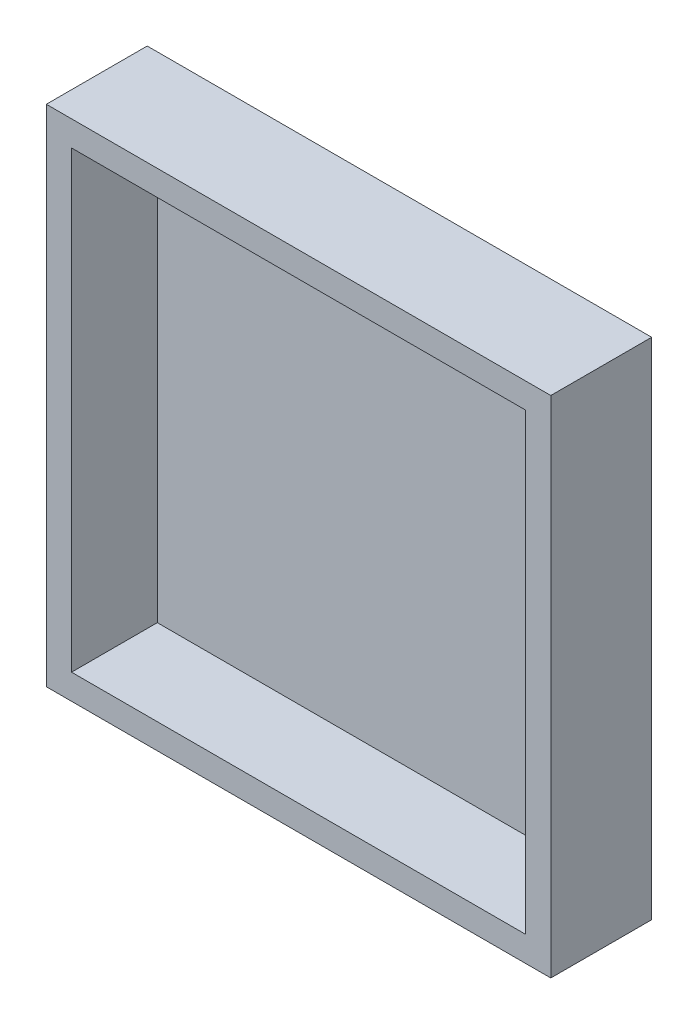
ISO-10303-21;
HEADER;
FILE_DESCRIPTION(('STEP AP214'),'2;1');
FILE_NAME('part.step','',(''),(''),'','','');
FILE_SCHEMA(('AUTOMOTIVE_DESIGN { 1 0 10303 214 1 1 1 1 }'));
ENDSEC;
DATA;
#1=APPLICATION_CONTEXT('core data for automotive mechanical design processes');
#2=APPLICATION_PROTOCOL_DEFINITION('international standard','automotive_design',2000,#1);
#3=PRODUCT_CONTEXT('',#1,'mechanical');
#4=PRODUCT('Part','Part','',(#3));
#5=PRODUCT_RELATED_PRODUCT_CATEGORY('part','',(#4));
#6=PRODUCT_DEFINITION_FORMATION('','',#4);
#7=PRODUCT_DEFINITION_CONTEXT('part definition',#1,'design');
#8=PRODUCT_DEFINITION('design','',#6,#7);
#9=PRODUCT_DEFINITION_SHAPE('','',#8);
#10=(LENGTH_UNIT() NAMED_UNIT(*) SI_UNIT(.MILLI.,.METRE.));
#11=(NAMED_UNIT(*) PLANE_ANGLE_UNIT() SI_UNIT($,.RADIAN.));
#12=(NAMED_UNIT(*) SI_UNIT($,.STERADIAN.) SOLID_ANGLE_UNIT());
#13=UNCERTAINTY_MEASURE_WITH_UNIT(LENGTH_MEASURE(1.E-05),#10,'distance_accuracy_value','');
#14=(GEOMETRIC_REPRESENTATION_CONTEXT(3) GLOBAL_UNCERTAINTY_ASSIGNED_CONTEXT((#13)) GLOBAL_UNIT_ASSIGNED_CONTEXT((#10,
#11,#12)) REPRESENTATION_CONTEXT('',''));
#15=CARTESIAN_POINT('',(0.,0.,0.));
#16=DIRECTION('',(0.,0.,1.));
#17=DIRECTION('',(1.,0.,0.));
#18=AXIS2_PLACEMENT_3D('',#15,#16,#17);
#19=CARTESIAN_POINT('',(-63.5,63.5,25.4));
#20=DIRECTION('',(0.,1.,0.));
#21=DIRECTION('',(0.,0.,1.));
#22=AXIS2_PLACEMENT_3D('',#19,#20,#21);
#23=PLANE('',#22);
#24=DIRECTION('',(1.,0.,0.));
#25=VECTOR('',#24,1.);
#26=CARTESIAN_POINT('',(-63.5,63.5,0.));
#27=LINE('',#26,#25);
#28=CARTESIAN_POINT('',(-63.5,63.5,0.));
#29=VERTEX_POINT('',#28);
#30=CARTESIAN_POINT('',(63.5,63.5,0.));
#31=VERTEX_POINT('',#30);
#32=EDGE_CURVE('E157',#29,#31,#27,.T.);
#33=ORIENTED_EDGE('',*,*,#32,.F.);
#34=DIRECTION('',(0.,0.,-1.));
#35=VECTOR('',#34,1.);
#36=CARTESIAN_POINT('',(-63.5,63.5,25.4));
#37=LINE('',#36,#35);
#38=CARTESIAN_POINT('',(-63.5,63.5,25.4));
#39=VERTEX_POINT('',#38);
#40=EDGE_CURVE('E11',#39,#29,#37,.T.);
#41=ORIENTED_EDGE('',*,*,#40,.F.);
#42=DIRECTION('',(1.,0.,0.));
#43=VECTOR('',#42,1.);
#44=CARTESIAN_POINT('',(-63.5,63.5,25.4));
#45=LINE('',#44,#43);
#46=CARTESIAN_POINT('',(63.5,63.5,25.4));
#47=VERTEX_POINT('',#46);
#48=EDGE_CURVE('E163',#39,#47,#45,.T.);
#49=ORIENTED_EDGE('',*,*,#48,.T.);
#50=DIRECTION('',(0.,0.,-1.));
#51=VECTOR('',#50,1.);
#52=CARTESIAN_POINT('',(63.5,63.5,25.4));
#53=LINE('',#52,#51);
#54=EDGE_CURVE('E42',#47,#31,#53,.T.);
#55=ORIENTED_EDGE('',*,*,#54,.T.);
#56=EDGE_LOOP('',(#33,#41,#49,#55));
#57=FACE_BOUND('',#56,.T.);
#58=ADVANCED_FACE('F39',(#57),#23,.T.);
#59=CARTESIAN_POINT('',(-63.5,-63.5,25.4));
#60=DIRECTION('',(-1.,0.,0.));
#61=DIRECTION('',(0.,0.,1.));
#62=AXIS2_PLACEMENT_3D('',#59,#60,#61);
#63=PLANE('',#62);
#64=DIRECTION('',(0.,1.,0.));
#65=VECTOR('',#64,1.);
#66=CARTESIAN_POINT('',(-63.5,-63.5,0.));
#67=LINE('',#66,#65);
#68=CARTESIAN_POINT('',(-63.5,-63.5,0.));
#69=VERTEX_POINT('',#68);
#70=EDGE_CURVE('E166',#69,#29,#67,.T.);
#71=ORIENTED_EDGE('',*,*,#70,.F.);
#72=DIRECTION('',(0.,0.,-1.));
#73=VECTOR('',#72,1.);
#74=CARTESIAN_POINT('',(-63.5,-63.5,25.4));
#75=LINE('',#74,#73);
#76=CARTESIAN_POINT('',(-63.5,-63.5,25.4));
#77=VERTEX_POINT('',#76);
#78=EDGE_CURVE('E48',#77,#69,#75,.T.);
#79=ORIENTED_EDGE('',*,*,#78,.F.);
#80=DIRECTION('',(0.,1.,0.));
#81=VECTOR('',#80,1.);
#82=CARTESIAN_POINT('',(-63.5,-63.5,25.4));
#83=LINE('',#82,#81);
#84=EDGE_CURVE('E172',#77,#39,#83,.T.);
#85=ORIENTED_EDGE('',*,*,#84,.T.);
#86=ORIENTED_EDGE('',*,*,#40,.T.);
#87=EDGE_LOOP('',(#71,#79,#85,#86));
#88=FACE_BOUND('',#87,.T.);
#89=ADVANCED_FACE('F200',(#88),#63,.T.);
#90=CARTESIAN_POINT('',(-63.5,-63.5,25.4));
#91=DIRECTION('',(0.,1.,0.));
#92=DIRECTION('',(0.,0.,1.));
#93=AXIS2_PLACEMENT_3D('',#90,#91,#92);
#94=PLANE('',#93);
#95=DIRECTION('',(1.,0.,0.));
#96=VECTOR('',#95,1.);
#97=CARTESIAN_POINT('',(-63.5,-63.5,0.));
#98=LINE('',#97,#96);
#99=CARTESIAN_POINT('',(63.5,-63.5,0.));
#100=VERTEX_POINT('',#99);
#101=EDGE_CURVE('E182',#69,#100,#98,.T.);
#102=ORIENTED_EDGE('',*,*,#101,.T.);
#103=DIRECTION('',(0.,0.,-1.));
#104=VECTOR('',#103,1.);
#105=CARTESIAN_POINT('',(63.5,-63.5,25.4));
#106=LINE('',#105,#104);
#107=CARTESIAN_POINT('',(63.5,-63.5,25.4));
#108=VERTEX_POINT('',#107);
#109=EDGE_CURVE('E189',#108,#100,#106,.T.);
#110=ORIENTED_EDGE('',*,*,#109,.F.);
#111=DIRECTION('',(1.,0.,0.));
#112=VECTOR('',#111,1.);
#113=CARTESIAN_POINT('',(-63.5,-63.5,25.4));
#114=LINE('',#113,#112);
#115=EDGE_CURVE('E169',#77,#108,#114,.T.);
#116=ORIENTED_EDGE('',*,*,#115,.F.);
#117=ORIENTED_EDGE('',*,*,#78,.T.);
#118=EDGE_LOOP('',(#102,#110,#116,#117));
#119=FACE_BOUND('',#118,.T.);
#120=ADVANCED_FACE('F204',(#119),#94,.F.);
#121=CARTESIAN_POINT('',(63.5,-63.5,25.4));
#122=DIRECTION('',(-1.,0.,0.));
#123=DIRECTION('',(0.,0.,1.));
#124=AXIS2_PLACEMENT_3D('',#121,#122,#123);
#125=PLANE('',#124);
#126=DIRECTION('',(0.,1.,0.));
#127=VECTOR('',#126,1.);
#128=CARTESIAN_POINT('',(63.5,-63.5,0.));
#129=LINE('',#128,#127);
#130=EDGE_CURVE('E178',#100,#31,#129,.T.);
#131=ORIENTED_EDGE('',*,*,#130,.T.);
#132=ORIENTED_EDGE('',*,*,#54,.F.);
#133=DIRECTION('',(0.,1.,0.));
#134=VECTOR('',#133,1.);
#135=CARTESIAN_POINT('',(63.5,-63.5,25.4));
#136=LINE('',#135,#134);
#137=EDGE_CURVE('E89',#108,#47,#136,.T.);
#138=ORIENTED_EDGE('',*,*,#137,.F.);
#139=ORIENTED_EDGE('',*,*,#109,.T.);
#140=EDGE_LOOP('',(#131,#132,#138,#139));
#141=FACE_BOUND('',#140,.T.);
#142=ADVANCED_FACE('F196',(#141),#125,.F.);
#143=CARTESIAN_POINT('',(0.,0.,25.4));
#144=DIRECTION('',(0.,0.,1.));
#145=DIRECTION('',(1.,0.,0.));
#146=AXIS2_PLACEMENT_3D('',#143,#144,#145);
#147=PLANE('',#146);
#148=DIRECTION('',(0.,1.,0.));
#149=VECTOR('',#148,1.);
#150=CARTESIAN_POINT('',(57.15,-57.15,25.4));
#151=LINE('',#150,#149);
#152=CARTESIAN_POINT('',(57.15,-57.15,25.4));
#153=VERTEX_POINT('',#152);
#154=CARTESIAN_POINT('',(57.15,57.15,25.4));
#155=VERTEX_POINT('',#154);
#156=EDGE_CURVE('E56',#153,#155,#151,.T.);
#157=ORIENTED_EDGE('',*,*,#156,.F.);
#158=DIRECTION('',(1.,0.,0.));
#159=VECTOR('',#158,1.);
#160=CARTESIAN_POINT('',(-57.15,-57.15,25.4));
#161=LINE('',#160,#159);
#162=CARTESIAN_POINT('',(-57.15,-57.15,25.4));
#163=VERTEX_POINT('',#162);
#164=EDGE_CURVE('E135',#163,#153,#161,.T.);
#165=ORIENTED_EDGE('',*,*,#164,.F.);
#166=DIRECTION('',(0.,-1.,0.));
#167=VECTOR('',#166,1.);
#168=CARTESIAN_POINT('',(-57.15,-57.15,25.4));
#169=LINE('',#168,#167);
#170=CARTESIAN_POINT('',(-57.15,57.15,25.4));
#171=VERTEX_POINT('',#170);
#172=EDGE_CURVE('E139',#171,#163,#169,.T.);
#173=ORIENTED_EDGE('',*,*,#172,.F.);
#174=DIRECTION('',(-1.,0.,0.));
#175=VECTOR('',#174,1.);
#176=CARTESIAN_POINT('',(-57.15,57.15,25.4));
#177=LINE('',#176,#175);
#178=EDGE_CURVE('E148',#155,#171,#177,.T.);
#179=ORIENTED_EDGE('',*,*,#178,.F.);
#180=EDGE_LOOP('',(#157,#165,#173,#179));
#181=FACE_BOUND('',#180,.T.);
#182=ORIENTED_EDGE('',*,*,#48,.F.);
#183=ORIENTED_EDGE('',*,*,#84,.F.);
#184=ORIENTED_EDGE('',*,*,#115,.T.);
#185=ORIENTED_EDGE('',*,*,#137,.T.);
#186=EDGE_LOOP('',(#182,#183,#184,#185));
#187=FACE_BOUND('',#186,.T.);
#188=ADVANCED_FACE('F205',(#181,#187),#147,.T.);
#189=CARTESIAN_POINT('',(0.,0.,0.));
#190=DIRECTION('',(0.,0.,1.));
#191=DIRECTION('',(1.,0.,0.));
#192=AXIS2_PLACEMENT_3D('',#189,#190,#191);
#193=PLANE('',#192);
#194=ORIENTED_EDGE('',*,*,#32,.T.);
#195=ORIENTED_EDGE('',*,*,#130,.F.);
#196=ORIENTED_EDGE('',*,*,#101,.F.);
#197=ORIENTED_EDGE('',*,*,#70,.T.);
#198=EDGE_LOOP('',(#194,#195,#196,#197));
#199=FACE_BOUND('',#198,.T.);
#200=ADVANCED_FACE('F199',(#199),#193,.F.);
#201=CARTESIAN_POINT('',(57.15,-57.15,3.81000000000002));
#202=DIRECTION('',(1.,0.,0.));
#203=DIRECTION('',(0.,0.,-1.));
#204=AXIS2_PLACEMENT_3D('',#201,#202,#203);
#205=PLANE('',#204);
#206=ORIENTED_EDGE('',*,*,#156,.T.);
#207=DIRECTION('',(0.,0.,1.));
#208=VECTOR('',#207,1.);
#209=CARTESIAN_POINT('',(57.15,57.15,3.81000000000002));
#210=LINE('',#209,#208);
#211=CARTESIAN_POINT('',(57.15,57.15,3.81000000000002));
#212=VERTEX_POINT('',#211);
#213=EDGE_CURVE('E110',#212,#155,#210,.T.);
#214=ORIENTED_EDGE('',*,*,#213,.F.);
#215=DIRECTION('',(0.,1.,0.));
#216=VECTOR('',#215,1.);
#217=CARTESIAN_POINT('',(57.15,-57.15,3.81000000000002));
#218=LINE('',#217,#216);
#219=CARTESIAN_POINT('',(57.15,-57.15,3.81000000000002));
#220=VERTEX_POINT('',#219);
#221=EDGE_CURVE('E114',#220,#212,#218,.T.);
#222=ORIENTED_EDGE('',*,*,#221,.F.);
#223=DIRECTION('',(0.,0.,1.));
#224=VECTOR('',#223,1.);
#225=CARTESIAN_POINT('',(57.15,-57.15,3.81000000000002));
#226=LINE('',#225,#224);
#227=EDGE_CURVE('E154',#220,#153,#226,.T.);
#228=ORIENTED_EDGE('',*,*,#227,.T.);
#229=EDGE_LOOP('',(#206,#214,#222,#228));
#230=FACE_BOUND('',#229,.T.);
#231=ADVANCED_FACE('F112',(#230),#205,.F.);
#232=CARTESIAN_POINT('',(-57.15,-57.15,3.81000000000002));
#233=DIRECTION('',(0.,-1.,0.));
#234=DIRECTION('',(0.,0.,-1.));
#235=AXIS2_PLACEMENT_3D('',#232,#233,#234);
#236=PLANE('',#235);
#237=ORIENTED_EDGE('',*,*,#164,.T.);
#238=ORIENTED_EDGE('',*,*,#227,.F.);
#239=DIRECTION('',(1.,0.,0.));
#240=VECTOR('',#239,1.);
#241=CARTESIAN_POINT('',(-57.15,-57.15,3.81000000000002));
#242=LINE('',#241,#240);
#243=CARTESIAN_POINT('',(-57.15,-57.15,3.81000000000002));
#244=VERTEX_POINT('',#243);
#245=EDGE_CURVE('E121',#244,#220,#242,.T.);
#246=ORIENTED_EDGE('',*,*,#245,.F.);
#247=DIRECTION('',(0.,0.,1.));
#248=VECTOR('',#247,1.);
#249=CARTESIAN_POINT('',(-57.15,-57.15,3.81000000000002));
#250=LINE('',#249,#248);
#251=EDGE_CURVE('E158',#244,#163,#250,.T.);
#252=ORIENTED_EDGE('',*,*,#251,.T.);
#253=EDGE_LOOP('',(#237,#238,#246,#252));
#254=FACE_BOUND('',#253,.T.);
#255=ADVANCED_FACE('F249',(#254),#236,.F.);
#256=CARTESIAN_POINT('',(-57.15,-57.15,3.81000000000002));
#257=DIRECTION('',(-1.,0.,0.));
#258=DIRECTION('',(0.,0.,1.));
#259=AXIS2_PLACEMENT_3D('',#256,#257,#258);
#260=PLANE('',#259);
#261=ORIENTED_EDGE('',*,*,#172,.T.);
#262=ORIENTED_EDGE('',*,*,#251,.F.);
#263=DIRECTION('',(0.,-1.,0.));
#264=VECTOR('',#263,1.);
#265=CARTESIAN_POINT('',(-57.15,-57.15,3.81000000000002));
#266=LINE('',#265,#264);
#267=CARTESIAN_POINT('',(-57.15,57.15,3.81000000000002));
#268=VERTEX_POINT('',#267);
#269=EDGE_CURVE('E130',#268,#244,#266,.T.);
#270=ORIENTED_EDGE('',*,*,#269,.F.);
#271=DIRECTION('',(0.,0.,1.));
#272=VECTOR('',#271,1.);
#273=CARTESIAN_POINT('',(-57.15,57.15,3.81000000000002));
#274=LINE('',#273,#272);
#275=EDGE_CURVE('E120',#268,#171,#274,.T.);
#276=ORIENTED_EDGE('',*,*,#275,.T.);
#277=EDGE_LOOP('',(#261,#262,#270,#276));
#278=FACE_BOUND('',#277,.T.);
#279=ADVANCED_FACE('F257',(#278),#260,.F.);
#280=CARTESIAN_POINT('',(-57.15,57.15,3.81000000000002));
#281=DIRECTION('',(0.,1.,0.));
#282=DIRECTION('',(0.,0.,1.));
#283=AXIS2_PLACEMENT_3D('',#280,#281,#282);
#284=PLANE('',#283);
#285=ORIENTED_EDGE('',*,*,#178,.T.);
#286=ORIENTED_EDGE('',*,*,#275,.F.);
#287=DIRECTION('',(-1.,0.,0.));
#288=VECTOR('',#287,1.);
#289=CARTESIAN_POINT('',(-57.15,57.15,3.81000000000002));
#290=LINE('',#289,#288);
#291=EDGE_CURVE('E124',#212,#268,#290,.T.);
#292=ORIENTED_EDGE('',*,*,#291,.F.);
#293=ORIENTED_EDGE('',*,*,#213,.T.);
#294=EDGE_LOOP('',(#285,#286,#292,#293));
#295=FACE_BOUND('',#294,.T.);
#296=ADVANCED_FACE('F125',(#295),#284,.F.);
#297=CARTESIAN_POINT('',(0.,0.,3.81000000000002));
#298=DIRECTION('',(0.,0.,-1.));
#299=DIRECTION('',(-1.,0.,0.));
#300=AXIS2_PLACEMENT_3D('',#297,#298,#299);
#301=PLANE('',#300);
#302=ORIENTED_EDGE('',*,*,#221,.T.);
#303=ORIENTED_EDGE('',*,*,#291,.T.);
#304=ORIENTED_EDGE('',*,*,#269,.T.);
#305=ORIENTED_EDGE('',*,*,#245,.T.);
#306=EDGE_LOOP('',(#302,#303,#304,#305));
#307=FACE_BOUND('',#306,.T.);
#308=ADVANCED_FACE('F132',(#307),#301,.F.);
#309=CLOSED_SHELL('',(#58,#89,#120,#142,#188,#200,#231,#255,#279,#296,#308));
#310=MANIFOLD_SOLID_BREP('B2',#309);
#311=ADVANCED_BREP_SHAPE_REPRESENTATION('',(#18,#310),#14);
#312=SHAPE_DEFINITION_REPRESENTATION(#9,#311);
ENDSEC;
END-ISO-10303-21;
